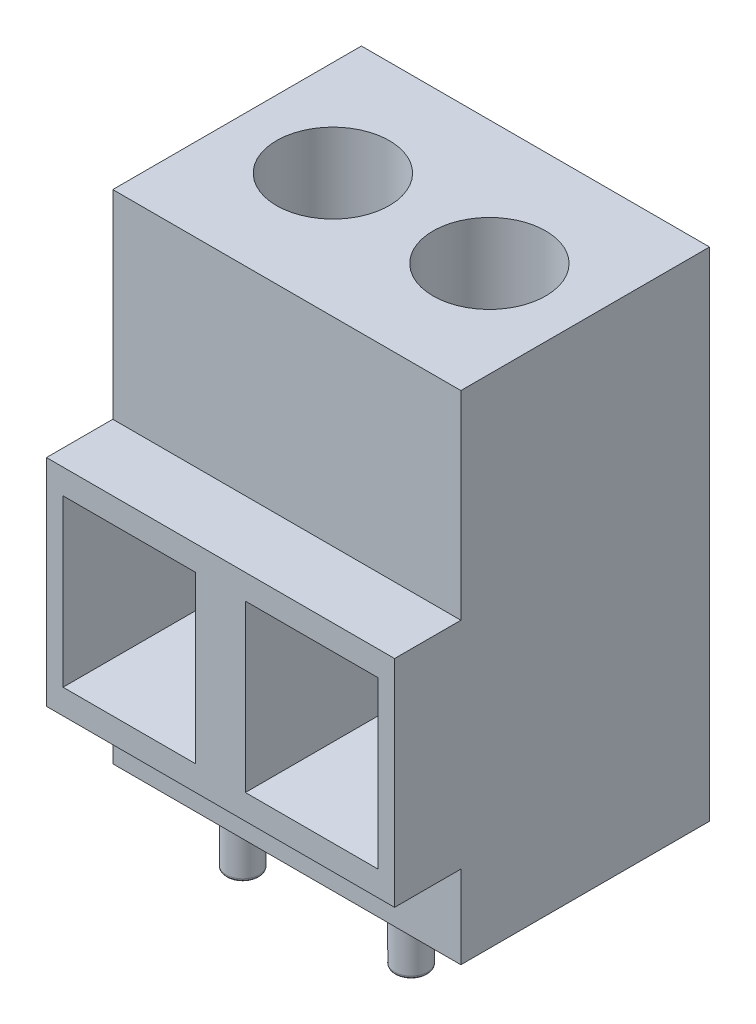
ISO-10303-21;
HEADER;
FILE_DESCRIPTION(('STEP AP214'),'2;1');
FILE_NAME('part.step','',(''),(''),'','','');
FILE_SCHEMA(('AUTOMOTIVE_DESIGN { 1 0 10303 214 1 1 1 1 }'));
ENDSEC;
DATA;
#1=APPLICATION_CONTEXT('core data for automotive mechanical design processes');
#2=APPLICATION_PROTOCOL_DEFINITION('international standard','automotive_design',2000,#1);
#3=PRODUCT_CONTEXT('',#1,'mechanical');
#4=PRODUCT('Part','Part','',(#3));
#5=PRODUCT_RELATED_PRODUCT_CATEGORY('part','',(#4));
#6=PRODUCT_DEFINITION_FORMATION('','',#4);
#7=PRODUCT_DEFINITION_CONTEXT('part definition',#1,'design');
#8=PRODUCT_DEFINITION('design','',#6,#7);
#9=PRODUCT_DEFINITION_SHAPE('','',#8);
#10=(LENGTH_UNIT() NAMED_UNIT(*) SI_UNIT(.MILLI.,.METRE.));
#11=(NAMED_UNIT(*) PLANE_ANGLE_UNIT() SI_UNIT($,.RADIAN.));
#12=(NAMED_UNIT(*) SI_UNIT($,.STERADIAN.) SOLID_ANGLE_UNIT());
#13=UNCERTAINTY_MEASURE_WITH_UNIT(LENGTH_MEASURE(1.E-05),#10,'distance_accuracy_value','');
#14=(GEOMETRIC_REPRESENTATION_CONTEXT(3) GLOBAL_UNCERTAINTY_ASSIGNED_CONTEXT((#13)) GLOBAL_UNIT_ASSIGNED_CONTEXT((#10,
#11,#12)) REPRESENTATION_CONTEXT('',''));
#15=CARTESIAN_POINT('',(0.,0.,0.));
#16=DIRECTION('',(0.,0.,1.));
#17=DIRECTION('',(1.,0.,0.));
#18=AXIS2_PLACEMENT_3D('',#15,#16,#17);
#19=CARTESIAN_POINT('',(4.72,7.,0.));
#20=DIRECTION('',(0.,1.,0.));
#21=DIRECTION('',(0.,0.,1.));
#22=AXIS2_PLACEMENT_3D('',#19,#20,#21);
#23=PLANE('',#22);
#24=CARTESIAN_POINT('',(4.72,7.,0.));
#25=DIRECTION('',(0.,1.,0.));
#26=DIRECTION('',(0.,0.,1.));
#27=AXIS2_PLACEMENT_3D('',#24,#25,#26);
#28=CIRCLE('',#27,3.4);
#29=CARTESIAN_POINT('',(8.08303434416005,7.,-0.5));
#30=VERTEX_POINT('',#29);
#31=CARTESIAN_POINT('',(1.35696565583995,7.,-0.5));
#32=VERTEX_POINT('',#31);
#33=EDGE_CURVE('E220',#30,#32,#28,.T.);
#34=ORIENTED_EDGE('',*,*,#33,.T.);
#35=DIRECTION('',(1.,0.,0.));
#36=VECTOR('',#35,1.);
#37=CARTESIAN_POINT('',(1.35696565583995,7.,-0.5));
#38=LINE('',#37,#36);
#39=EDGE_CURVE('E231',#32,#30,#38,.T.);
#40=ORIENTED_EDGE('',*,*,#39,.T.);
#41=EDGE_LOOP('',(#34,#40));
#42=FACE_BOUND('',#41,.T.);
#43=ADVANCED_FACE('F37',(#42),#23,.T.);
#44=CARTESIAN_POINT('',(-4.72,7.,0.));
#45=DIRECTION('',(0.,1.,0.));
#46=DIRECTION('',(0.,0.,1.));
#47=AXIS2_PLACEMENT_3D('',#44,#45,#46);
#48=PLANE('',#47);
#49=CARTESIAN_POINT('',(-4.72,7.,0.));
#50=DIRECTION('',(0.,1.,0.));
#51=DIRECTION('',(0.,0.,1.));
#52=AXIS2_PLACEMENT_3D('',#49,#50,#51);
#53=CIRCLE('',#52,3.4);
#54=CARTESIAN_POINT('',(-1.35696565583995,7.,-0.5));
#55=VERTEX_POINT('',#54);
#56=CARTESIAN_POINT('',(-8.08303434416005,7.,-0.5));
#57=VERTEX_POINT('',#56);
#58=EDGE_CURVE('E325',#55,#57,#53,.T.);
#59=ORIENTED_EDGE('',*,*,#58,.T.);
#60=DIRECTION('',(1.,0.,0.));
#61=VECTOR('',#60,1.);
#62=CARTESIAN_POINT('',(0.,7.,-0.5));
#63=LINE('',#62,#61);
#64=EDGE_CURVE('E221',#57,#55,#63,.T.);
#65=ORIENTED_EDGE('',*,*,#64,.T.);
#66=EDGE_LOOP('',(#59,#65));
#67=FACE_BOUND('',#66,.T.);
#68=ADVANCED_FACE('F436',(#67),#48,.T.);
#69=CARTESIAN_POINT('',(10.5,-15.,0.));
#70=DIRECTION('',(0.,1.,0.));
#71=DIRECTION('',(0.,0.,1.));
#72=AXIS2_PLACEMENT_3D('',#69,#70,#71);
#73=PLANE('',#72);
#74=CARTESIAN_POINT('',(-5.08,-15.,-5.08));
#75=DIRECTION('',(0.,1.,0.));
#76=DIRECTION('',(0.,0.,1.));
#77=AXIS2_PLACEMENT_3D('',#74,#75,#76);
#78=CIRCLE('',#77,1.);
#79=CARTESIAN_POINT('',(-5.08,-15.,-4.08));
#80=VERTEX_POINT('',#79);
#81=EDGE_CURVE('E401',#80,#80,#78,.F.);
#82=ORIENTED_EDGE('',*,*,#81,.F.);
#83=EDGE_LOOP('',(#82));
#84=FACE_BOUND('',#83,.T.);
#85=CARTESIAN_POINT('',(5.08,-15.,-5.08));
#86=DIRECTION('',(0.,1.,0.));
#87=DIRECTION('',(0.,0.,1.));
#88=AXIS2_PLACEMENT_3D('',#85,#86,#87);
#89=CIRCLE('',#88,1.);
#90=CARTESIAN_POINT('',(5.08,-15.,-4.08));
#91=VERTEX_POINT('',#90);
#92=EDGE_CURVE('E398',#91,#91,#89,.F.);
#93=ORIENTED_EDGE('',*,*,#92,.F.);
#94=EDGE_LOOP('',(#93));
#95=FACE_BOUND('',#94,.T.);
#96=CARTESIAN_POINT('',(5.08,-15.,5.08));
#97=DIRECTION('',(0.,1.,0.));
#98=DIRECTION('',(0.,0.,1.));
#99=AXIS2_PLACEMENT_3D('',#96,#97,#98);
#100=CIRCLE('',#99,1.);
#101=CARTESIAN_POINT('',(5.08,-15.,6.08));
#102=VERTEX_POINT('',#101);
#103=EDGE_CURVE('E395',#102,#102,#100,.F.);
#104=ORIENTED_EDGE('',*,*,#103,.F.);
#105=EDGE_LOOP('',(#104));
#106=FACE_BOUND('',#105,.T.);
#107=CARTESIAN_POINT('',(-5.08,-15.,5.08));
#108=DIRECTION('',(0.,1.,0.));
#109=DIRECTION('',(0.,0.,1.));
#110=AXIS2_PLACEMENT_3D('',#107,#108,#109);
#111=CIRCLE('',#110,1.);
#112=CARTESIAN_POINT('',(-5.08,-15.,6.08));
#113=VERTEX_POINT('',#112);
#114=EDGE_CURVE('E392',#113,#113,#111,.F.);
#115=ORIENTED_EDGE('',*,*,#114,.F.);
#116=EDGE_LOOP('',(#115));
#117=FACE_BOUND('',#116,.T.);
#118=DIRECTION('',(0.,0.,-1.));
#119=VECTOR('',#118,1.);
#120=CARTESIAN_POINT('',(-10.5,-15.,0.));
#121=LINE('',#120,#119);
#122=CARTESIAN_POINT('',(-10.5,-15.,7.5));
#123=VERTEX_POINT('',#122);
#124=CARTESIAN_POINT('',(-10.5,-15.,-7.5));
#125=VERTEX_POINT('',#124);
#126=EDGE_CURVE('E354',#123,#125,#121,.T.);
#127=ORIENTED_EDGE('',*,*,#126,.T.);
#128=DIRECTION('',(-1.,0.,0.));
#129=VECTOR('',#128,1.);
#130=CARTESIAN_POINT('',(10.5,-15.,-7.5));
#131=LINE('',#130,#129);
#132=CARTESIAN_POINT('',(10.5,-15.,-7.5));
#133=VERTEX_POINT('',#132);
#134=EDGE_CURVE('E389',#133,#125,#131,.T.);
#135=ORIENTED_EDGE('',*,*,#134,.F.);
#136=DIRECTION('',(0.,0.,-1.));
#137=VECTOR('',#136,1.);
#138=CARTESIAN_POINT('',(10.5,-15.,0.));
#139=LINE('',#138,#137);
#140=CARTESIAN_POINT('',(10.5,-15.,7.5));
#141=VERTEX_POINT('',#140);
#142=EDGE_CURVE('E334',#141,#133,#139,.T.);
#143=ORIENTED_EDGE('',*,*,#142,.F.);
#144=DIRECTION('',(-1.,0.,0.));
#145=VECTOR('',#144,1.);
#146=CARTESIAN_POINT('',(10.5,-15.,7.5));
#147=LINE('',#146,#145);
#148=EDGE_CURVE('E374',#141,#123,#147,.T.);
#149=ORIENTED_EDGE('',*,*,#148,.T.);
#150=EDGE_LOOP('',(#127,#135,#143,#149));
#151=FACE_BOUND('',#150,.T.);
#152=ADVANCED_FACE('F443',(#84,#95,#106,#117,#151),#73,.F.);
#153=CARTESIAN_POINT('',(10.5,0.,-7.5));
#154=DIRECTION('',(0.,0.,1.));
#155=DIRECTION('',(1.,0.,0.));
#156=AXIS2_PLACEMENT_3D('',#153,#154,#155);
#157=PLANE('',#156);
#158=DIRECTION('',(0.,1.,0.));
#159=VECTOR('',#158,1.);
#160=CARTESIAN_POINT('',(-10.5,0.,-7.5));
#161=LINE('',#160,#159);
#162=CARTESIAN_POINT('',(-10.5,15.,-7.5));
#163=VERTEX_POINT('',#162);
#164=EDGE_CURVE('E357',#125,#163,#161,.T.);
#165=ORIENTED_EDGE('',*,*,#164,.T.);
#166=DIRECTION('',(-1.,0.,0.));
#167=VECTOR('',#166,1.);
#168=CARTESIAN_POINT('',(10.5,15.,-7.5));
#169=LINE('',#168,#167);
#170=CARTESIAN_POINT('',(10.5,15.,-7.5));
#171=VERTEX_POINT('',#170);
#172=EDGE_CURVE('E387',#171,#163,#169,.T.);
#173=ORIENTED_EDGE('',*,*,#172,.F.);
#174=DIRECTION('',(0.,1.,0.));
#175=VECTOR('',#174,1.);
#176=CARTESIAN_POINT('',(10.5,0.,-7.5));
#177=LINE('',#176,#175);
#178=EDGE_CURVE('E337',#133,#171,#177,.T.);
#179=ORIENTED_EDGE('',*,*,#178,.F.);
#180=ORIENTED_EDGE('',*,*,#134,.T.);
#181=EDGE_LOOP('',(#165,#173,#179,#180));
#182=FACE_BOUND('',#181,.T.);
#183=ADVANCED_FACE('F541',(#182),#157,.F.);
#184=CARTESIAN_POINT('',(10.5,15.,0.));
#185=DIRECTION('',(0.,1.,0.));
#186=DIRECTION('',(0.,0.,1.));
#187=AXIS2_PLACEMENT_3D('',#184,#185,#186);
#188=PLANE('',#187);
#189=CARTESIAN_POINT('',(-4.72,15.,0.));
#190=DIRECTION('',(0.,1.,0.));
#191=DIRECTION('',(0.,0.,1.));
#192=AXIS2_PLACEMENT_3D('',#189,#190,#191);
#193=CIRCLE('',#192,3.4);
#194=CARTESIAN_POINT('',(-4.72,15.,3.4));
#195=VERTEX_POINT('',#194);
#196=EDGE_CURVE('E326',#195,#195,#193,.T.);
#197=ORIENTED_EDGE('',*,*,#196,.F.);
#198=EDGE_LOOP('',(#197));
#199=FACE_BOUND('',#198,.T.);
#200=CARTESIAN_POINT('',(4.72,15.,0.));
#201=DIRECTION('',(0.,1.,0.));
#202=DIRECTION('',(0.,0.,1.));
#203=AXIS2_PLACEMENT_3D('',#200,#201,#202);
#204=CIRCLE('',#203,3.4);
#205=CARTESIAN_POINT('',(4.72,15.,3.4));
#206=VERTEX_POINT('',#205);
#207=EDGE_CURVE('E273',#206,#206,#204,.T.);
#208=ORIENTED_EDGE('',*,*,#207,.F.);
#209=EDGE_LOOP('',(#208));
#210=FACE_BOUND('',#209,.T.);
#211=DIRECTION('',(0.,0.,-1.));
#212=VECTOR('',#211,1.);
#213=CARTESIAN_POINT('',(-10.5,15.,0.));
#214=LINE('',#213,#212);
#215=CARTESIAN_POINT('',(-10.5,15.,7.5));
#216=VERTEX_POINT('',#215);
#217=EDGE_CURVE('E360',#216,#163,#214,.T.);
#218=ORIENTED_EDGE('',*,*,#217,.F.);
#219=DIRECTION('',(-1.,0.,0.));
#220=VECTOR('',#219,1.);
#221=CARTESIAN_POINT('',(10.5,15.,7.5));
#222=LINE('',#221,#220);
#223=CARTESIAN_POINT('',(10.5,15.,7.5));
#224=VERTEX_POINT('',#223);
#225=EDGE_CURVE('E385',#224,#216,#222,.T.);
#226=ORIENTED_EDGE('',*,*,#225,.F.);
#227=DIRECTION('',(0.,0.,-1.));
#228=VECTOR('',#227,1.);
#229=CARTESIAN_POINT('',(10.5,15.,0.));
#230=LINE('',#229,#228);
#231=EDGE_CURVE('E340',#224,#171,#230,.T.);
#232=ORIENTED_EDGE('',*,*,#231,.T.);
#233=ORIENTED_EDGE('',*,*,#172,.T.);
#234=EDGE_LOOP('',(#218,#226,#232,#233));
#235=FACE_BOUND('',#234,.T.);
#236=ADVANCED_FACE('F537',(#199,#210,#235),#188,.T.);
#237=CARTESIAN_POINT('',(10.5,0.,7.5));
#238=DIRECTION('',(0.,0.,1.));
#239=DIRECTION('',(1.,0.,0.));
#240=AXIS2_PLACEMENT_3D('',#237,#238,#239);
#241=PLANE('',#240);
#242=DIRECTION('',(0.,1.,0.));
#243=VECTOR('',#242,1.);
#244=CARTESIAN_POINT('',(-10.5,0.,7.5));
#245=LINE('',#244,#243);
#246=CARTESIAN_POINT('',(-10.5,3.,7.5));
#247=VERTEX_POINT('',#246);
#248=EDGE_CURVE('E363',#247,#216,#245,.T.);
#249=ORIENTED_EDGE('',*,*,#248,.F.);
#250=DIRECTION('',(-1.,0.,0.));
#251=VECTOR('',#250,1.);
#252=CARTESIAN_POINT('',(10.5,3.,7.5));
#253=LINE('',#252,#251);
#254=CARTESIAN_POINT('',(10.5,3.,7.5));
#255=VERTEX_POINT('',#254);
#256=EDGE_CURVE('E383',#255,#247,#253,.T.);
#257=ORIENTED_EDGE('',*,*,#256,.F.);
#258=DIRECTION('',(0.,1.,0.));
#259=VECTOR('',#258,1.);
#260=CARTESIAN_POINT('',(10.5,0.,7.5));
#261=LINE('',#260,#259);
#262=EDGE_CURVE('E343',#255,#224,#261,.T.);
#263=ORIENTED_EDGE('',*,*,#262,.T.);
#264=ORIENTED_EDGE('',*,*,#225,.T.);
#265=EDGE_LOOP('',(#249,#257,#263,#264));
#266=FACE_BOUND('',#265,.T.);
#267=ADVANCED_FACE('F540',(#266),#241,.T.);
#268=CARTESIAN_POINT('',(10.5,3.,0.));
#269=DIRECTION('',(0.,-1.,0.));
#270=DIRECTION('',(0.,0.,-1.));
#271=AXIS2_PLACEMENT_3D('',#268,#269,#270);
#272=PLANE('',#271);
#273=DIRECTION('',(0.,0.,1.));
#274=VECTOR('',#273,1.);
#275=CARTESIAN_POINT('',(-10.5,3.,0.));
#276=LINE('',#275,#274);
#277=CARTESIAN_POINT('',(-10.5,3.,11.5));
#278=VERTEX_POINT('',#277);
#279=EDGE_CURVE('E366',#247,#278,#276,.T.);
#280=ORIENTED_EDGE('',*,*,#279,.T.);
#281=DIRECTION('',(-1.,0.,0.));
#282=VECTOR('',#281,1.);
#283=CARTESIAN_POINT('',(10.5,3.,11.5));
#284=LINE('',#283,#282);
#285=CARTESIAN_POINT('',(10.5,3.,11.5));
#286=VERTEX_POINT('',#285);
#287=EDGE_CURVE('E380',#286,#278,#284,.T.);
#288=ORIENTED_EDGE('',*,*,#287,.F.);
#289=DIRECTION('',(0.,0.,1.));
#290=VECTOR('',#289,1.);
#291=CARTESIAN_POINT('',(10.5,3.,0.));
#292=LINE('',#291,#290);
#293=EDGE_CURVE('E346',#255,#286,#292,.T.);
#294=ORIENTED_EDGE('',*,*,#293,.F.);
#295=ORIENTED_EDGE('',*,*,#256,.T.);
#296=EDGE_LOOP('',(#280,#288,#294,#295));
#297=FACE_BOUND('',#296,.T.);
#298=ADVANCED_FACE('F578',(#297),#272,.F.);
#299=CARTESIAN_POINT('',(10.5,0.,11.5));
#300=DIRECTION('',(0.,0.,-1.));
#301=DIRECTION('',(0.,1.,0.));
#302=AXIS2_PLACEMENT_3D('',#299,#300,#301);
#303=PLANE('',#302);
#304=DIRECTION('',(-1.,0.,0.));
#305=VECTOR('',#304,1.);
#306=CARTESIAN_POINT('',(-9.5,1.5,11.5));
#307=LINE('',#306,#305);
#308=CARTESIAN_POINT('',(-1.5,1.5,11.5));
#309=VERTEX_POINT('',#308);
#310=CARTESIAN_POINT('',(-9.5,1.5,11.5));
#311=VERTEX_POINT('',#310);
#312=EDGE_CURVE('E260',#309,#311,#307,.T.);
#313=ORIENTED_EDGE('',*,*,#312,.F.);
#314=DIRECTION('',(0.,1.,0.));
#315=VECTOR('',#314,1.);
#316=CARTESIAN_POINT('',(-1.5,-8.5,11.5));
#317=LINE('',#316,#315);
#318=CARTESIAN_POINT('',(-1.5,-8.5,11.5));
#319=VERTEX_POINT('',#318);
#320=EDGE_CURVE('E258',#319,#309,#317,.T.);
#321=ORIENTED_EDGE('',*,*,#320,.F.);
#322=DIRECTION('',(1.,0.,0.));
#323=VECTOR('',#322,1.);
#324=CARTESIAN_POINT('',(-9.5,-8.5,11.5));
#325=LINE('',#324,#323);
#326=CARTESIAN_POINT('',(-9.5,-8.5,11.5));
#327=VERTEX_POINT('',#326);
#328=EDGE_CURVE('E267',#327,#319,#325,.T.);
#329=ORIENTED_EDGE('',*,*,#328,.F.);
#330=DIRECTION('',(0.,-1.,0.));
#331=VECTOR('',#330,1.);
#332=CARTESIAN_POINT('',(-9.5,-8.5,11.5));
#333=LINE('',#332,#331);
#334=EDGE_CURVE('E264',#311,#327,#333,.T.);
#335=ORIENTED_EDGE('',*,*,#334,.F.);
#336=EDGE_LOOP('',(#313,#321,#329,#335));
#337=FACE_BOUND('',#336,.T.);
#338=DIRECTION('',(-1.,0.,0.));
#339=VECTOR('',#338,1.);
#340=CARTESIAN_POINT('',(1.5,1.5,11.5));
#341=LINE('',#340,#339);
#342=CARTESIAN_POINT('',(9.5,1.5,11.5));
#343=VERTEX_POINT('',#342);
#344=CARTESIAN_POINT('',(1.5,1.5,11.5));
#345=VERTEX_POINT('',#344);
#346=EDGE_CURVE('E293',#343,#345,#341,.T.);
#347=ORIENTED_EDGE('',*,*,#346,.F.);
#348=DIRECTION('',(0.,1.,0.));
#349=VECTOR('',#348,1.);
#350=CARTESIAN_POINT('',(9.5,-8.5,11.5));
#351=LINE('',#350,#349);
#352=CARTESIAN_POINT('',(9.5,-8.5,11.5));
#353=VERTEX_POINT('',#352);
#354=EDGE_CURVE('E252',#353,#343,#351,.T.);
#355=ORIENTED_EDGE('',*,*,#354,.F.);
#356=DIRECTION('',(1.,0.,0.));
#357=VECTOR('',#356,1.);
#358=CARTESIAN_POINT('',(1.5,-8.5,11.5));
#359=LINE('',#358,#357);
#360=CARTESIAN_POINT('',(1.5,-8.5,11.5));
#361=VERTEX_POINT('',#360);
#362=EDGE_CURVE('E299',#361,#353,#359,.T.);
#363=ORIENTED_EDGE('',*,*,#362,.F.);
#364=DIRECTION('',(0.,-1.,0.));
#365=VECTOR('',#364,1.);
#366=CARTESIAN_POINT('',(1.5,-8.5,11.5));
#367=LINE('',#366,#365);
#368=EDGE_CURVE('E296',#345,#361,#367,.T.);
#369=ORIENTED_EDGE('',*,*,#368,.F.);
#370=EDGE_LOOP('',(#347,#355,#363,#369));
#371=FACE_BOUND('',#370,.T.);
#372=DIRECTION('',(0.,-1.,0.));
#373=VECTOR('',#372,1.);
#374=CARTESIAN_POINT('',(-10.5,0.,11.5));
#375=LINE('',#374,#373);
#376=CARTESIAN_POINT('',(-10.5,-10.,11.5));
#377=VERTEX_POINT('',#376);
#378=EDGE_CURVE('E368',#278,#377,#375,.T.);
#379=ORIENTED_EDGE('',*,*,#378,.T.);
#380=DIRECTION('',(-1.,0.,0.));
#381=VECTOR('',#380,1.);
#382=CARTESIAN_POINT('',(10.5,-10.,11.5));
#383=LINE('',#382,#381);
#384=CARTESIAN_POINT('',(10.5,-10.,11.5));
#385=VERTEX_POINT('',#384);
#386=EDGE_CURVE('E378',#385,#377,#383,.T.);
#387=ORIENTED_EDGE('',*,*,#386,.F.);
#388=DIRECTION('',(0.,-1.,0.));
#389=VECTOR('',#388,1.);
#390=CARTESIAN_POINT('',(10.5,0.,11.5));
#391=LINE('',#390,#389);
#392=EDGE_CURVE('E349',#286,#385,#391,.T.);
#393=ORIENTED_EDGE('',*,*,#392,.F.);
#394=ORIENTED_EDGE('',*,*,#287,.T.);
#395=EDGE_LOOP('',(#379,#387,#393,#394));
#396=FACE_BOUND('',#395,.T.);
#397=ADVANCED_FACE('F575',(#337,#371,#396),#303,.F.);
#398=CARTESIAN_POINT('',(10.5,-10.,0.));
#399=DIRECTION('',(0.,-1.,0.));
#400=DIRECTION('',(0.,0.,-1.));
#401=AXIS2_PLACEMENT_3D('',#398,#399,#400);
#402=PLANE('',#401);
#403=DIRECTION('',(0.,0.,1.));
#404=VECTOR('',#403,1.);
#405=CARTESIAN_POINT('',(-10.5,-10.,0.));
#406=LINE('',#405,#404);
#407=CARTESIAN_POINT('',(-10.5,-10.,7.5));
#408=VERTEX_POINT('',#407);
#409=EDGE_CURVE('E371',#408,#377,#406,.T.);
#410=ORIENTED_EDGE('',*,*,#409,.F.);
#411=DIRECTION('',(-1.,0.,0.));
#412=VECTOR('',#411,1.);
#413=CARTESIAN_POINT('',(10.5,-10.,7.5));
#414=LINE('',#413,#412);
#415=CARTESIAN_POINT('',(10.5,-10.,7.5));
#416=VERTEX_POINT('',#415);
#417=EDGE_CURVE('E376',#416,#408,#414,.T.);
#418=ORIENTED_EDGE('',*,*,#417,.F.);
#419=DIRECTION('',(0.,0.,1.));
#420=VECTOR('',#419,1.);
#421=CARTESIAN_POINT('',(10.5,-10.,0.));
#422=LINE('',#421,#420);
#423=EDGE_CURVE('E351',#416,#385,#422,.T.);
#424=ORIENTED_EDGE('',*,*,#423,.T.);
#425=ORIENTED_EDGE('',*,*,#386,.T.);
#426=EDGE_LOOP('',(#410,#418,#424,#425));
#427=FACE_BOUND('',#426,.T.);
#428=ADVANCED_FACE('F572',(#427),#402,.T.);
#429=EDGE_CURVE('E338',#123,#408,#245,.T.);
#430=ORIENTED_EDGE('',*,*,#429,.F.);
#431=ORIENTED_EDGE('',*,*,#148,.F.);
#432=EDGE_CURVE('E347',#141,#416,#261,.T.);
#433=ORIENTED_EDGE('',*,*,#432,.T.);
#434=ORIENTED_EDGE('',*,*,#417,.T.);
#435=EDGE_LOOP('',(#430,#431,#433,#434));
#436=FACE_BOUND('',#435,.T.);
#437=ADVANCED_FACE('F567',(#436),#241,.T.);
#438=CARTESIAN_POINT('',(10.5,0.,0.));
#439=DIRECTION('',(1.,0.,0.));
#440=DIRECTION('',(0.,0.,-1.));
#441=AXIS2_PLACEMENT_3D('',#438,#439,#440);
#442=PLANE('',#441);
#443=ORIENTED_EDGE('',*,*,#142,.T.);
#444=ORIENTED_EDGE('',*,*,#178,.T.);
#445=ORIENTED_EDGE('',*,*,#231,.F.);
#446=ORIENTED_EDGE('',*,*,#262,.F.);
#447=ORIENTED_EDGE('',*,*,#293,.T.);
#448=ORIENTED_EDGE('',*,*,#392,.T.);
#449=ORIENTED_EDGE('',*,*,#423,.F.);
#450=ORIENTED_EDGE('',*,*,#432,.F.);
#451=EDGE_LOOP('',(#443,#444,#445,#446,#447,#448,#449,#450));
#452=FACE_BOUND('',#451,.T.);
#453=ADVANCED_FACE('F557',(#452),#442,.T.);
#454=CARTESIAN_POINT('',(-10.5,0.,0.));
#455=DIRECTION('',(1.,0.,0.));
#456=DIRECTION('',(0.,0.,-1.));
#457=AXIS2_PLACEMENT_3D('',#454,#455,#456);
#458=PLANE('',#457);
#459=ORIENTED_EDGE('',*,*,#126,.F.);
#460=ORIENTED_EDGE('',*,*,#429,.T.);
#461=ORIENTED_EDGE('',*,*,#409,.T.);
#462=ORIENTED_EDGE('',*,*,#378,.F.);
#463=ORIENTED_EDGE('',*,*,#279,.F.);
#464=ORIENTED_EDGE('',*,*,#248,.T.);
#465=ORIENTED_EDGE('',*,*,#217,.T.);
#466=ORIENTED_EDGE('',*,*,#164,.F.);
#467=EDGE_LOOP('',(#459,#460,#461,#462,#463,#464,#465,#466));
#468=FACE_BOUND('',#467,.T.);
#469=ADVANCED_FACE('F457',(#468),#458,.F.);
#470=CARTESIAN_POINT('',(4.72,7.,0.));
#471=DIRECTION('',(0.,1.,0.));
#472=DIRECTION('',(0.,0.,1.));
#473=AXIS2_PLACEMENT_3D('',#470,#471,#472);
#474=CYLINDRICAL_SURFACE('',#473,3.4);
#475=ORIENTED_EDGE('',*,*,#33,.F.);
#476=DIRECTION('',(0.,1.,0.));
#477=VECTOR('',#476,1.);
#478=CARTESIAN_POINT('',(8.08303434416005,6.,-0.5));
#479=LINE('',#478,#477);
#480=CARTESIAN_POINT('',(8.08303434416005,6.,-0.5));
#481=VERTEX_POINT('',#480);
#482=EDGE_CURVE('E203',#481,#30,#479,.T.);
#483=ORIENTED_EDGE('',*,*,#482,.F.);
#484=CARTESIAN_POINT('',(4.72,6.,0.));
#485=DIRECTION('',(0.,1.,0.));
#486=DIRECTION('',(0.,0.,1.));
#487=AXIS2_PLACEMENT_3D('',#484,#485,#486);
#488=CIRCLE('',#487,3.4);
#489=CARTESIAN_POINT('',(8.08303434416005,6.,0.5));
#490=VERTEX_POINT('',#489);
#491=EDGE_CURVE('E210',#490,#481,#488,.T.);
#492=ORIENTED_EDGE('',*,*,#491,.F.);
#493=DIRECTION('',(0.,1.,0.));
#494=VECTOR('',#493,1.);
#495=CARTESIAN_POINT('',(8.08303434416005,6.,0.5));
#496=LINE('',#495,#494);
#497=CARTESIAN_POINT('',(8.08303434416005,7.,0.5));
#498=VERTEX_POINT('',#497);
#499=EDGE_CURVE('E222',#490,#498,#496,.T.);
#500=ORIENTED_EDGE('',*,*,#499,.T.);
#501=CARTESIAN_POINT('',(1.35696565583995,7.,0.5));
#502=VERTEX_POINT('',#501);
#503=EDGE_CURVE('E329',#502,#498,#28,.T.);
#504=ORIENTED_EDGE('',*,*,#503,.F.);
#505=DIRECTION('',(0.,1.,0.));
#506=VECTOR('',#505,1.);
#507=CARTESIAN_POINT('',(1.35696565583995,6.,0.499999999999999));
#508=LINE('',#507,#506);
#509=CARTESIAN_POINT('',(1.35696565583995,6.,0.499999999999999));
#510=VERTEX_POINT('',#509);
#511=EDGE_CURVE('E52',#510,#502,#508,.T.);
#512=ORIENTED_EDGE('',*,*,#511,.F.);
#513=CARTESIAN_POINT('',(4.72,6.,0.));
#514=DIRECTION('',(0.,1.,0.));
#515=DIRECTION('',(0.,0.,1.));
#516=AXIS2_PLACEMENT_3D('',#513,#514,#515);
#517=CIRCLE('',#516,3.4);
#518=CARTESIAN_POINT('',(1.35696565583995,6.,-0.5));
#519=VERTEX_POINT('',#518);
#520=EDGE_CURVE('E227',#519,#510,#517,.T.);
#521=ORIENTED_EDGE('',*,*,#520,.F.);
#522=DIRECTION('',(0.,1.,0.));
#523=VECTOR('',#522,1.);
#524=CARTESIAN_POINT('',(1.35696565583995,6.,-0.5));
#525=LINE('',#524,#523);
#526=EDGE_CURVE('E205',#519,#32,#525,.T.);
#527=ORIENTED_EDGE('',*,*,#526,.T.);
#528=EDGE_LOOP('',(#475,#483,#492,#500,#504,#512,#521,#527));
#529=FACE_BOUND('',#528,.T.);
#530=ORIENTED_EDGE('',*,*,#207,.T.);
#531=EDGE_LOOP('',(#530));
#532=FACE_BOUND('',#531,.T.);
#533=ADVANCED_FACE('F216',(#529,#532),#474,.F.);
#534=DIRECTION('',(1.,0.,0.));
#535=VECTOR('',#534,1.);
#536=CARTESIAN_POINT('',(1.35696565583995,7.,0.5));
#537=LINE('',#536,#535);
#538=EDGE_CURVE('E211',#502,#498,#537,.T.);
#539=ORIENTED_EDGE('',*,*,#538,.F.);
#540=ORIENTED_EDGE('',*,*,#503,.T.);
#541=EDGE_LOOP('',(#539,#540));
#542=FACE_BOUND('',#541,.T.);
#543=ADVANCED_FACE('F439',(#542),#23,.T.);
#544=CARTESIAN_POINT('',(-4.72,7.,0.));
#545=DIRECTION('',(0.,1.,0.));
#546=DIRECTION('',(0.,0.,1.));
#547=AXIS2_PLACEMENT_3D('',#544,#545,#546);
#548=CYLINDRICAL_SURFACE('',#547,3.4);
#549=ORIENTED_EDGE('',*,*,#58,.F.);
#550=DIRECTION('',(0.,1.,0.));
#551=VECTOR('',#550,1.);
#552=CARTESIAN_POINT('',(-1.35696565583995,6.,-0.5));
#553=LINE('',#552,#551);
#554=CARTESIAN_POINT('',(-1.35696565583995,6.,-0.5));
#555=VERTEX_POINT('',#554);
#556=EDGE_CURVE('E250',#555,#55,#553,.T.);
#557=ORIENTED_EDGE('',*,*,#556,.F.);
#558=CARTESIAN_POINT('',(-4.72,6.,0.));
#559=DIRECTION('',(0.,1.,0.));
#560=DIRECTION('',(0.,0.,1.));
#561=AXIS2_PLACEMENT_3D('',#558,#559,#560);
#562=CIRCLE('',#561,3.4);
#563=CARTESIAN_POINT('',(-1.35696565583995,6.,0.5));
#564=VERTEX_POINT('',#563);
#565=EDGE_CURVE('E244',#564,#555,#562,.T.);
#566=ORIENTED_EDGE('',*,*,#565,.F.);
#567=DIRECTION('',(0.,1.,0.));
#568=VECTOR('',#567,1.);
#569=CARTESIAN_POINT('',(-1.35696565583995,6.,0.5));
#570=LINE('',#569,#568);
#571=CARTESIAN_POINT('',(-1.35696565583995,7.,0.5));
#572=VERTEX_POINT('',#571);
#573=EDGE_CURVE('E253',#564,#572,#570,.T.);
#574=ORIENTED_EDGE('',*,*,#573,.T.);
#575=CARTESIAN_POINT('',(-8.08303434416005,7.,0.5));
#576=VERTEX_POINT('',#575);
#577=EDGE_CURVE('E322',#576,#572,#53,.T.);
#578=ORIENTED_EDGE('',*,*,#577,.F.);
#579=DIRECTION('',(0.,1.,0.));
#580=VECTOR('',#579,1.);
#581=CARTESIAN_POINT('',(-8.08303434416005,6.,0.5));
#582=LINE('',#581,#580);
#583=CARTESIAN_POINT('',(-8.08303434416005,6.,0.5));
#584=VERTEX_POINT('',#583);
#585=EDGE_CURVE('E60',#584,#576,#582,.T.);
#586=ORIENTED_EDGE('',*,*,#585,.F.);
#587=CARTESIAN_POINT('',(-8.08303434416005,6.,-0.5));
#588=VERTEX_POINT('',#587);
#589=EDGE_CURVE('E239',#588,#584,#562,.T.);
#590=ORIENTED_EDGE('',*,*,#589,.F.);
#591=DIRECTION('',(0.,1.,0.));
#592=VECTOR('',#591,1.);
#593=CARTESIAN_POINT('',(-8.08303434416005,6.,-0.5));
#594=LINE('',#593,#592);
#595=EDGE_CURVE('E256',#588,#57,#594,.T.);
#596=ORIENTED_EDGE('',*,*,#595,.T.);
#597=EDGE_LOOP('',(#549,#557,#566,#574,#578,#586,#590,#596));
#598=FACE_BOUND('',#597,.T.);
#599=ORIENTED_EDGE('',*,*,#196,.T.);
#600=EDGE_LOOP('',(#599));
#601=FACE_BOUND('',#600,.T.);
#602=ADVANCED_FACE('F450',(#598,#601),#548,.F.);
#603=DIRECTION('',(1.,0.,0.));
#604=VECTOR('',#603,1.);
#605=CARTESIAN_POINT('',(0.,7.,0.5));
#606=LINE('',#605,#604);
#607=EDGE_CURVE('E240',#576,#572,#606,.T.);
#608=ORIENTED_EDGE('',*,*,#607,.F.);
#609=ORIENTED_EDGE('',*,*,#577,.T.);
#610=EDGE_LOOP('',(#608,#609));
#611=FACE_BOUND('',#610,.T.);
#612=ADVANCED_FACE('F446',(#611),#48,.T.);
#613=CARTESIAN_POINT('',(9.5,-8.5,11.5));
#614=DIRECTION('',(0.994521895368273,0.,-0.104528463267654));
#615=DIRECTION('',(-0.104528463267654,0.,-0.994521895368273));
#616=AXIS2_PLACEMENT_3D('',#613,#614,#615);
#617=PLANE('',#616);
#618=ORIENTED_EDGE('',*,*,#354,.T.);
#619=DIRECTION('',(0.103962051184498,0.103962051184498,0.989132844377854));
#620=VECTOR('',#619,1.);
#621=CARTESIAN_POINT('',(9.39191891913512,1.39191891913512,10.4716772060452));
#622=LINE('',#621,#620);
#623=CARTESIAN_POINT('',(7.81833223574917,-0.181667764250827,-4.5));
#624=VERTEX_POINT('',#623);
#625=EDGE_CURVE('E305',#624,#343,#622,.T.);
#626=ORIENTED_EDGE('',*,*,#625,.F.);
#627=DIRECTION('',(0.,1.,0.));
#628=VECTOR('',#627,1.);
#629=CARTESIAN_POINT('',(7.81833223574917,-8.5,-4.5));
#630=LINE('',#629,#628);
#631=CARTESIAN_POINT('',(7.81833223574917,-6.81833223574917,-4.5));
#632=VERTEX_POINT('',#631);
#633=EDGE_CURVE('E302',#632,#624,#630,.T.);
#634=ORIENTED_EDGE('',*,*,#633,.F.);
#635=DIRECTION('',(0.103962051184498,-0.103962051184498,0.989132844377854));
#636=VECTOR('',#635,1.);
#637=CARTESIAN_POINT('',(9.4135351353081,-8.4135351353081,10.6773417648362));
#638=LINE('',#637,#636);
#639=EDGE_CURVE('E261',#632,#353,#638,.T.);
#640=ORIENTED_EDGE('',*,*,#639,.T.);
#641=EDGE_LOOP('',(#618,#626,#634,#640));
#642=FACE_BOUND('',#641,.T.);
#643=ADVANCED_FACE('F507',(#642),#617,.F.);
#644=CARTESIAN_POINT('',(1.5,-8.5,11.5));
#645=DIRECTION('',(0.,-0.994521895368273,-0.104528463267654));
#646=DIRECTION('',(0.,0.104528463267654,-0.994521895368273));
#647=AXIS2_PLACEMENT_3D('',#644,#645,#646);
#648=PLANE('',#647);
#649=ORIENTED_EDGE('',*,*,#362,.T.);
#650=ORIENTED_EDGE('',*,*,#639,.F.);
#651=DIRECTION('',(1.,0.,0.));
#652=VECTOR('',#651,1.);
#653=CARTESIAN_POINT('',(1.5,-6.81833223574917,-4.5));
#654=LINE('',#653,#652);
#655=CARTESIAN_POINT('',(3.18166776425083,-6.81833223574917,-4.5));
#656=VERTEX_POINT('',#655);
#657=EDGE_CURVE('E309',#656,#632,#654,.T.);
#658=ORIENTED_EDGE('',*,*,#657,.F.);
#659=DIRECTION('',(-0.103962051184498,-0.103962051184498,0.989132844377854));
#660=VECTOR('',#659,1.);
#661=CARTESIAN_POINT('',(1.5,-8.5,11.5));
#662=LINE('',#661,#660);
#663=EDGE_CURVE('E304',#656,#361,#662,.T.);
#664=ORIENTED_EDGE('',*,*,#663,.T.);
#665=EDGE_LOOP('',(#649,#650,#658,#664));
#666=FACE_BOUND('',#665,.T.);
#667=ADVANCED_FACE('F510',(#666),#648,.F.);
#668=CARTESIAN_POINT('',(1.5,-8.5,11.5));
#669=DIRECTION('',(-0.994521895368273,0.,-0.104528463267654));
#670=DIRECTION('',(-0.104528463267654,0.,0.994521895368273));
#671=AXIS2_PLACEMENT_3D('',#668,#669,#670);
#672=PLANE('',#671);
#673=ORIENTED_EDGE('',*,*,#368,.T.);
#674=ORIENTED_EDGE('',*,*,#663,.F.);
#675=DIRECTION('',(0.,-1.,0.));
#676=VECTOR('',#675,1.);
#677=CARTESIAN_POINT('',(3.18166776425083,-8.5,-4.5));
#678=LINE('',#677,#676);
#679=CARTESIAN_POINT('',(3.18166776425083,-0.181667764250827,-4.5));
#680=VERTEX_POINT('',#679);
#681=EDGE_CURVE('E317',#680,#656,#678,.T.);
#682=ORIENTED_EDGE('',*,*,#681,.F.);
#683=DIRECTION('',(-0.103962051184498,0.103962051184498,0.989132844377854));
#684=VECTOR('',#683,1.);
#685=CARTESIAN_POINT('',(1.5,1.5,11.5));
#686=LINE('',#685,#684);
#687=EDGE_CURVE('E308',#680,#345,#686,.T.);
#688=ORIENTED_EDGE('',*,*,#687,.T.);
#689=EDGE_LOOP('',(#673,#674,#682,#688));
#690=FACE_BOUND('',#689,.T.);
#691=ADVANCED_FACE('F514',(#690),#672,.F.);
#692=CARTESIAN_POINT('',(1.5,1.5,11.5));
#693=DIRECTION('',(0.,0.994521895368273,-0.104528463267654));
#694=DIRECTION('',(0.,0.104528463267654,0.994521895368273));
#695=AXIS2_PLACEMENT_3D('',#692,#693,#694);
#696=PLANE('',#695);
#697=ORIENTED_EDGE('',*,*,#346,.T.);
#698=ORIENTED_EDGE('',*,*,#687,.F.);
#699=DIRECTION('',(-1.,0.,0.));
#700=VECTOR('',#699,1.);
#701=CARTESIAN_POINT('',(1.5,-0.181667764250827,-4.5));
#702=LINE('',#701,#700);
#703=EDGE_CURVE('E314',#624,#680,#702,.T.);
#704=ORIENTED_EDGE('',*,*,#703,.F.);
#705=ORIENTED_EDGE('',*,*,#625,.T.);
#706=EDGE_LOOP('',(#697,#698,#704,#705));
#707=FACE_BOUND('',#706,.T.);
#708=ADVANCED_FACE('F505',(#707),#696,.F.);
#709=CARTESIAN_POINT('',(0.,0.,-4.5));
#710=DIRECTION('',(0.,0.,-1.));
#711=DIRECTION('',(-1.,0.,0.));
#712=AXIS2_PLACEMENT_3D('',#709,#710,#711);
#713=PLANE('',#712);
#714=ORIENTED_EDGE('',*,*,#633,.T.);
#715=ORIENTED_EDGE('',*,*,#703,.T.);
#716=ORIENTED_EDGE('',*,*,#681,.T.);
#717=ORIENTED_EDGE('',*,*,#657,.T.);
#718=EDGE_LOOP('',(#714,#715,#716,#717));
#719=FACE_BOUND('',#718,.T.);
#720=ADVANCED_FACE('F491',(#719),#713,.F.);
#721=CARTESIAN_POINT('',(-1.5,-8.5,11.5));
#722=DIRECTION('',(0.994521895368273,0.,-0.104528463267654));
#723=DIRECTION('',(-0.104528463267654,0.,-0.994521895368273));
#724=AXIS2_PLACEMENT_3D('',#721,#722,#723);
#725=PLANE('',#724);
#726=ORIENTED_EDGE('',*,*,#320,.T.);
#727=DIRECTION('',(0.103962051184498,0.103962051184498,0.989132844377854));
#728=VECTOR('',#727,1.);
#729=CARTESIAN_POINT('',(-1.60808108086488,1.39191891913512,10.4716772060452));
#730=LINE('',#729,#728);
#731=CARTESIAN_POINT('',(-3.18166776425083,-0.181667764250828,-4.5));
#732=VERTEX_POINT('',#731);
#733=EDGE_CURVE('E275',#732,#309,#730,.T.);
#734=ORIENTED_EDGE('',*,*,#733,.F.);
#735=DIRECTION('',(0.,1.,0.));
#736=VECTOR('',#735,1.);
#737=CARTESIAN_POINT('',(-3.18166776425082,-8.5,-4.5));
#738=LINE('',#737,#736);
#739=CARTESIAN_POINT('',(-3.18166776425082,-6.81833223574917,-4.5));
#740=VERTEX_POINT('',#739);
#741=EDGE_CURVE('E270',#740,#732,#738,.T.);
#742=ORIENTED_EDGE('',*,*,#741,.F.);
#743=DIRECTION('',(0.103962051184498,-0.103962051184498,0.989132844377854));
#744=VECTOR('',#743,1.);
#745=CARTESIAN_POINT('',(-1.5864648646919,-8.4135351353081,10.6773417648362));
#746=LINE('',#745,#744);
#747=EDGE_CURVE('E271',#740,#319,#746,.T.);
#748=ORIENTED_EDGE('',*,*,#747,.T.);
#749=EDGE_LOOP('',(#726,#734,#742,#748));
#750=FACE_BOUND('',#749,.T.);
#751=ADVANCED_FACE('F487',(#750),#725,.F.);
#752=CARTESIAN_POINT('',(-9.5,-8.5,11.5));
#753=DIRECTION('',(0.,-0.994521895368273,-0.104528463267654));
#754=DIRECTION('',(0.,0.104528463267654,-0.994521895368273));
#755=AXIS2_PLACEMENT_3D('',#752,#753,#754);
#756=PLANE('',#755);
#757=ORIENTED_EDGE('',*,*,#328,.T.);
#758=ORIENTED_EDGE('',*,*,#747,.F.);
#759=DIRECTION('',(1.,0.,0.));
#760=VECTOR('',#759,1.);
#761=CARTESIAN_POINT('',(-9.5,-6.81833223574917,-4.5));
#762=LINE('',#761,#760);
#763=CARTESIAN_POINT('',(-7.81833223574917,-6.81833223574917,-4.5));
#764=VERTEX_POINT('',#763);
#765=EDGE_CURVE('E279',#764,#740,#762,.T.);
#766=ORIENTED_EDGE('',*,*,#765,.F.);
#767=DIRECTION('',(-0.103962051184498,-0.103962051184498,0.989132844377854));
#768=VECTOR('',#767,1.);
#769=CARTESIAN_POINT('',(-9.5,-8.5,11.5));
#770=LINE('',#769,#768);
#771=EDGE_CURVE('E274',#764,#327,#770,.T.);
#772=ORIENTED_EDGE('',*,*,#771,.T.);
#773=EDGE_LOOP('',(#757,#758,#766,#772));
#774=FACE_BOUND('',#773,.T.);
#775=ADVANCED_FACE('F490',(#774),#756,.F.);
#776=CARTESIAN_POINT('',(-9.5,-8.5,11.5));
#777=DIRECTION('',(-0.994521895368273,0.,-0.104528463267654));
#778=DIRECTION('',(-0.104528463267654,0.,0.994521895368273));
#779=AXIS2_PLACEMENT_3D('',#776,#777,#778);
#780=PLANE('',#779);
#781=ORIENTED_EDGE('',*,*,#334,.T.);
#782=ORIENTED_EDGE('',*,*,#771,.F.);
#783=DIRECTION('',(0.,-1.,0.));
#784=VECTOR('',#783,1.);
#785=CARTESIAN_POINT('',(-7.81833223574917,-8.5,-4.5));
#786=LINE('',#785,#784);
#787=CARTESIAN_POINT('',(-7.81833223574917,-0.181667764250828,-4.5));
#788=VERTEX_POINT('',#787);
#789=EDGE_CURVE('E287',#788,#764,#786,.T.);
#790=ORIENTED_EDGE('',*,*,#789,.F.);
#791=DIRECTION('',(-0.103962051184498,0.103962051184498,0.989132844377854));
#792=VECTOR('',#791,1.);
#793=CARTESIAN_POINT('',(-9.5,1.5,11.5));
#794=LINE('',#793,#792);
#795=EDGE_CURVE('E278',#788,#311,#794,.T.);
#796=ORIENTED_EDGE('',*,*,#795,.T.);
#797=EDGE_LOOP('',(#781,#782,#790,#796));
#798=FACE_BOUND('',#797,.T.);
#799=ADVANCED_FACE('F495',(#798),#780,.F.);
#800=CARTESIAN_POINT('',(-9.5,1.5,11.5));
#801=DIRECTION('',(0.,0.994521895368273,-0.104528463267654));
#802=DIRECTION('',(0.,0.104528463267654,0.994521895368273));
#803=AXIS2_PLACEMENT_3D('',#800,#801,#802);
#804=PLANE('',#803);
#805=ORIENTED_EDGE('',*,*,#312,.T.);
#806=ORIENTED_EDGE('',*,*,#795,.F.);
#807=DIRECTION('',(-1.,0.,0.));
#808=VECTOR('',#807,1.);
#809=CARTESIAN_POINT('',(-9.5,-0.181667764250828,-4.5));
#810=LINE('',#809,#808);
#811=EDGE_CURVE('E284',#732,#788,#810,.T.);
#812=ORIENTED_EDGE('',*,*,#811,.F.);
#813=ORIENTED_EDGE('',*,*,#733,.T.);
#814=EDGE_LOOP('',(#805,#806,#812,#813));
#815=FACE_BOUND('',#814,.T.);
#816=ADVANCED_FACE('F485',(#815),#804,.F.);
#817=CARTESIAN_POINT('',(0.,0.,-4.5));
#818=DIRECTION('',(0.,0.,-1.));
#819=DIRECTION('',(-1.,0.,0.));
#820=AXIS2_PLACEMENT_3D('',#817,#818,#819);
#821=PLANE('',#820);
#822=ORIENTED_EDGE('',*,*,#741,.T.);
#823=ORIENTED_EDGE('',*,*,#811,.T.);
#824=ORIENTED_EDGE('',*,*,#789,.T.);
#825=ORIENTED_EDGE('',*,*,#765,.T.);
#826=EDGE_LOOP('',(#822,#823,#824,#825));
#827=FACE_BOUND('',#826,.T.);
#828=ADVANCED_FACE('F481',(#827),#821,.F.);
#829=CARTESIAN_POINT('',(0.,6.,-0.5));
#830=DIRECTION('',(0.,0.,1.));
#831=DIRECTION('',(1.,0.,0.));
#832=AXIS2_PLACEMENT_3D('',#829,#830,#831);
#833=PLANE('',#832);
#834=ORIENTED_EDGE('',*,*,#64,.F.);
#835=ORIENTED_EDGE('',*,*,#595,.F.);
#836=DIRECTION('',(1.,0.,0.));
#837=VECTOR('',#836,1.);
#838=CARTESIAN_POINT('',(0.,6.,-0.5));
#839=LINE('',#838,#837);
#840=EDGE_CURVE('E237',#588,#555,#839,.T.);
#841=ORIENTED_EDGE('',*,*,#840,.T.);
#842=ORIENTED_EDGE('',*,*,#556,.T.);
#843=EDGE_LOOP('',(#834,#835,#841,#842));
#844=FACE_BOUND('',#843,.T.);
#845=ADVANCED_FACE('F478',(#844),#833,.T.);
#846=CARTESIAN_POINT('',(0.,6.,0.5));
#847=DIRECTION('',(0.,0.,1.));
#848=DIRECTION('',(1.,0.,0.));
#849=AXIS2_PLACEMENT_3D('',#846,#847,#848);
#850=PLANE('',#849);
#851=ORIENTED_EDGE('',*,*,#607,.T.);
#852=ORIENTED_EDGE('',*,*,#573,.F.);
#853=DIRECTION('',(1.,0.,0.));
#854=VECTOR('',#853,1.);
#855=CARTESIAN_POINT('',(0.,6.,0.5));
#856=LINE('',#855,#854);
#857=EDGE_CURVE('E243',#584,#564,#856,.T.);
#858=ORIENTED_EDGE('',*,*,#857,.F.);
#859=ORIENTED_EDGE('',*,*,#585,.T.);
#860=EDGE_LOOP('',(#851,#852,#858,#859));
#861=FACE_BOUND('',#860,.T.);
#862=ADVANCED_FACE('F474',(#861),#850,.F.);
#863=CARTESIAN_POINT('',(0.,6.,0.));
#864=DIRECTION('',(0.,1.,0.));
#865=DIRECTION('',(0.,0.,1.));
#866=AXIS2_PLACEMENT_3D('',#863,#864,#865);
#867=PLANE('',#866);
#868=ORIENTED_EDGE('',*,*,#840,.F.);
#869=ORIENTED_EDGE('',*,*,#589,.T.);
#870=ORIENTED_EDGE('',*,*,#857,.T.);
#871=ORIENTED_EDGE('',*,*,#565,.T.);
#872=EDGE_LOOP('',(#868,#869,#870,#871));
#873=FACE_BOUND('',#872,.T.);
#874=ADVANCED_FACE('F468',(#873),#867,.T.);
#875=CARTESIAN_POINT('',(1.35696565583995,6.,-0.5));
#876=DIRECTION('',(0.,0.,1.));
#877=DIRECTION('',(1.,0.,0.));
#878=AXIS2_PLACEMENT_3D('',#875,#876,#877);
#879=PLANE('',#878);
#880=ORIENTED_EDGE('',*,*,#39,.F.);
#881=ORIENTED_EDGE('',*,*,#526,.F.);
#882=DIRECTION('',(1.,0.,0.));
#883=VECTOR('',#882,1.);
#884=CARTESIAN_POINT('',(1.35696565583995,6.,-0.5));
#885=LINE('',#884,#883);
#886=EDGE_CURVE('E199',#519,#481,#885,.T.);
#887=ORIENTED_EDGE('',*,*,#886,.T.);
#888=ORIENTED_EDGE('',*,*,#482,.T.);
#889=EDGE_LOOP('',(#880,#881,#887,#888));
#890=FACE_BOUND('',#889,.T.);
#891=ADVANCED_FACE('F202',(#890),#879,.T.);
#892=CARTESIAN_POINT('',(1.35696565583995,6.,0.5));
#893=DIRECTION('',(0.,0.,1.));
#894=DIRECTION('',(1.,0.,0.));
#895=AXIS2_PLACEMENT_3D('',#892,#893,#894);
#896=PLANE('',#895);
#897=ORIENTED_EDGE('',*,*,#538,.T.);
#898=ORIENTED_EDGE('',*,*,#499,.F.);
#899=DIRECTION('',(1.,0.,0.));
#900=VECTOR('',#899,1.);
#901=CARTESIAN_POINT('',(1.35696565583995,6.,0.5));
#902=LINE('',#901,#900);
#903=EDGE_CURVE('E225',#510,#490,#902,.T.);
#904=ORIENTED_EDGE('',*,*,#903,.F.);
#905=ORIENTED_EDGE('',*,*,#511,.T.);
#906=EDGE_LOOP('',(#897,#898,#904,#905));
#907=FACE_BOUND('',#906,.T.);
#908=ADVANCED_FACE('F459',(#907),#896,.F.);
#909=CARTESIAN_POINT('',(4.72,6.,0.));
#910=DIRECTION('',(0.,1.,0.));
#911=DIRECTION('',(0.,0.,1.));
#912=AXIS2_PLACEMENT_3D('',#909,#910,#911);
#913=PLANE('',#912);
#914=ORIENTED_EDGE('',*,*,#886,.F.);
#915=ORIENTED_EDGE('',*,*,#520,.T.);
#916=ORIENTED_EDGE('',*,*,#903,.T.);
#917=ORIENTED_EDGE('',*,*,#491,.T.);
#918=EDGE_LOOP('',(#914,#915,#916,#917));
#919=FACE_BOUND('',#918,.T.);
#920=ADVANCED_FACE('F224',(#919),#913,.T.);
#921=CARTESIAN_POINT('',(-5.08,-19.,5.08));
#922=DIRECTION('',(0.,1.,0.));
#923=DIRECTION('',(0.,0.,1.));
#924=AXIS2_PLACEMENT_3D('',#921,#922,#923);
#925=CYLINDRICAL_SURFACE('',#924,1.);
#926=CARTESIAN_POINT('',(-5.08,-18.8,5.08));
#927=DIRECTION('',(0.,-1.,0.));
#928=DIRECTION('',(0.,0.,-1.));
#929=AXIS2_PLACEMENT_3D('',#926,#927,#928);
#930=CIRCLE('',#929,1.);
#931=CARTESIAN_POINT('',(-5.08,-18.8,4.08));
#932=VERTEX_POINT('',#931);
#933=EDGE_CURVE('E11',#932,#932,#930,.F.);
#934=ORIENTED_EDGE('',*,*,#933,.T.);
#935=EDGE_LOOP('',(#934));
#936=FACE_BOUND('',#935,.T.);
#937=ORIENTED_EDGE('',*,*,#114,.T.);
#938=EDGE_LOOP('',(#937));
#939=FACE_BOUND('',#938,.T.);
#940=ADVANCED_FACE('F466',(#936,#939),#925,.T.);
#941=CARTESIAN_POINT('',(-5.08,-19.,5.08));
#942=DIRECTION('',(0.,-1.,0.));
#943=DIRECTION('',(0.,0.,-1.));
#944=AXIS2_PLACEMENT_3D('',#941,#942,#943);
#945=PLANE('',#944);
#946=CARTESIAN_POINT('',(-5.08,-19.,5.08));
#947=DIRECTION('',(0.,-1.,0.));
#948=DIRECTION('',(0.,0.,-1.));
#949=AXIS2_PLACEMENT_3D('',#946,#947,#948);
#950=CIRCLE('',#949,0.8);
#951=CARTESIAN_POINT('',(-5.08,-19.,4.28));
#952=VERTEX_POINT('',#951);
#953=EDGE_CURVE('E45',#952,#952,#950,.T.);
#954=ORIENTED_EDGE('',*,*,#953,.T.);
#955=EDGE_LOOP('',(#954));
#956=FACE_BOUND('',#955,.T.);
#957=ADVANCED_FACE('F424',(#956),#945,.T.);
#958=CARTESIAN_POINT('',(5.08,-19.,5.08));
#959=DIRECTION('',(0.,1.,0.));
#960=DIRECTION('',(0.,0.,1.));
#961=AXIS2_PLACEMENT_3D('',#958,#959,#960);
#962=CYLINDRICAL_SURFACE('',#961,1.);
#963=CARTESIAN_POINT('',(5.08,-18.8,5.08));
#964=DIRECTION('',(0.,-1.,0.));
#965=DIRECTION('',(0.,0.,-1.));
#966=AXIS2_PLACEMENT_3D('',#963,#964,#965);
#967=CIRCLE('',#966,1.);
#968=CARTESIAN_POINT('',(5.08,-18.8,4.08));
#969=VERTEX_POINT('',#968);
#970=EDGE_CURVE('E419',#969,#969,#967,.F.);
#971=ORIENTED_EDGE('',*,*,#970,.T.);
#972=EDGE_LOOP('',(#971));
#973=FACE_BOUND('',#972,.T.);
#974=ORIENTED_EDGE('',*,*,#103,.T.);
#975=EDGE_LOOP('',(#974));
#976=FACE_BOUND('',#975,.T.);
#977=ADVANCED_FACE('F628',(#973,#976),#962,.T.);
#978=CARTESIAN_POINT('',(5.08,-19.,5.08));
#979=DIRECTION('',(0.,-1.,0.));
#980=DIRECTION('',(0.,0.,-1.));
#981=AXIS2_PLACEMENT_3D('',#978,#979,#980);
#982=PLANE('',#981);
#983=CARTESIAN_POINT('',(5.08,-19.,5.08));
#984=DIRECTION('',(0.,-1.,0.));
#985=DIRECTION('',(0.,0.,-1.));
#986=AXIS2_PLACEMENT_3D('',#983,#984,#985);
#987=CIRCLE('',#986,0.8);
#988=CARTESIAN_POINT('',(5.08,-19.,4.28));
#989=VERTEX_POINT('',#988);
#990=EDGE_CURVE('E416',#989,#989,#987,.T.);
#991=ORIENTED_EDGE('',*,*,#990,.T.);
#992=EDGE_LOOP('',(#991));
#993=FACE_BOUND('',#992,.T.);
#994=ADVANCED_FACE('F624',(#993),#982,.T.);
#995=CARTESIAN_POINT('',(5.08,-19.,-5.08));
#996=DIRECTION('',(0.,1.,0.));
#997=DIRECTION('',(0.,0.,1.));
#998=AXIS2_PLACEMENT_3D('',#995,#996,#997);
#999=CYLINDRICAL_SURFACE('',#998,1.);
#1000=CARTESIAN_POINT('',(5.08,-18.8,-5.08));
#1001=DIRECTION('',(0.,-1.,0.));
#1002=DIRECTION('',(0.,0.,-1.));
#1003=AXIS2_PLACEMENT_3D('',#1000,#1001,#1002);
#1004=CIRCLE('',#1003,1.);
#1005=CARTESIAN_POINT('',(5.08,-18.8,-6.08));
#1006=VERTEX_POINT('',#1005);
#1007=EDGE_CURVE('E407',#1006,#1006,#1004,.F.);
#1008=ORIENTED_EDGE('',*,*,#1007,.T.);
#1009=EDGE_LOOP('',(#1008));
#1010=FACE_BOUND('',#1009,.T.);
#1011=ORIENTED_EDGE('',*,*,#92,.T.);
#1012=EDGE_LOOP('',(#1011));
#1013=FACE_BOUND('',#1012,.T.);
#1014=ADVANCED_FACE('F620',(#1010,#1013),#999,.T.);
#1015=CARTESIAN_POINT('',(5.08,-19.,-5.08));
#1016=DIRECTION('',(0.,-1.,0.));
#1017=DIRECTION('',(0.,0.,-1.));
#1018=AXIS2_PLACEMENT_3D('',#1015,#1016,#1017);
#1019=PLANE('',#1018);
#1020=CARTESIAN_POINT('',(5.08,-19.,-5.08));
#1021=DIRECTION('',(0.,-1.,0.));
#1022=DIRECTION('',(0.,0.,-1.));
#1023=AXIS2_PLACEMENT_3D('',#1020,#1021,#1022);
#1024=CIRCLE('',#1023,0.8);
#1025=CARTESIAN_POINT('',(5.08,-19.,-5.88));
#1026=VERTEX_POINT('',#1025);
#1027=EDGE_CURVE('E404',#1026,#1026,#1024,.T.);
#1028=ORIENTED_EDGE('',*,*,#1027,.T.);
#1029=EDGE_LOOP('',(#1028));
#1030=FACE_BOUND('',#1029,.T.);
#1031=ADVANCED_FACE('F614',(#1030),#1019,.T.);
#1032=CARTESIAN_POINT('',(-5.08,-19.,-5.08));
#1033=DIRECTION('',(0.,1.,0.));
#1034=DIRECTION('',(0.,0.,1.));
#1035=AXIS2_PLACEMENT_3D('',#1032,#1033,#1034);
#1036=CYLINDRICAL_SURFACE('',#1035,1.);
#1037=CARTESIAN_POINT('',(-5.08,-18.8,-5.08));
#1038=DIRECTION('',(0.,-1.,0.));
#1039=DIRECTION('',(0.,0.,-1.));
#1040=AXIS2_PLACEMENT_3D('',#1037,#1038,#1039);
#1041=CIRCLE('',#1040,1.);
#1042=CARTESIAN_POINT('',(-5.08,-18.8,-6.08));
#1043=VERTEX_POINT('',#1042);
#1044=EDGE_CURVE('E413',#1043,#1043,#1041,.F.);
#1045=ORIENTED_EDGE('',*,*,#1044,.T.);
#1046=EDGE_LOOP('',(#1045));
#1047=FACE_BOUND('',#1046,.T.);
#1048=ORIENTED_EDGE('',*,*,#81,.T.);
#1049=EDGE_LOOP('',(#1048));
#1050=FACE_BOUND('',#1049,.T.);
#1051=ADVANCED_FACE('F609',(#1047,#1050),#1036,.T.);
#1052=CARTESIAN_POINT('',(-5.08,-19.,-5.08));
#1053=DIRECTION('',(0.,-1.,0.));
#1054=DIRECTION('',(0.,0.,-1.));
#1055=AXIS2_PLACEMENT_3D('',#1052,#1053,#1054);
#1056=PLANE('',#1055);
#1057=CARTESIAN_POINT('',(-5.08,-19.,-5.08));
#1058=DIRECTION('',(0.,-1.,0.));
#1059=DIRECTION('',(0.,0.,-1.));
#1060=AXIS2_PLACEMENT_3D('',#1057,#1058,#1059);
#1061=CIRCLE('',#1060,0.8);
#1062=CARTESIAN_POINT('',(-5.08,-19.,-5.88));
#1063=VERTEX_POINT('',#1062);
#1064=EDGE_CURVE('E410',#1063,#1063,#1061,.T.);
#1065=ORIENTED_EDGE('',*,*,#1064,.T.);
#1066=EDGE_LOOP('',(#1065));
#1067=FACE_BOUND('',#1066,.T.);
#1068=ADVANCED_FACE('F598',(#1067),#1056,.T.);
#1069=CARTESIAN_POINT('',(5.08,-18.8,-5.08));
#1070=DIRECTION('',(0.,-1.,0.));
#1071=DIRECTION('',(0.,0.,-1.));
#1072=AXIS2_PLACEMENT_3D('',#1069,#1070,#1071);
#1073=TOROIDAL_SURFACE('',#1072,0.8,0.2);
#1074=ORIENTED_EDGE('',*,*,#1007,.F.);
#1075=EDGE_LOOP('',(#1074));
#1076=FACE_BOUND('',#1075,.T.);
#1077=ORIENTED_EDGE('',*,*,#1027,.F.);
#1078=EDGE_LOOP('',(#1077));
#1079=FACE_BOUND('',#1078,.T.);
#1080=ADVANCED_FACE('F595',(#1076,#1079),#1073,.T.);
#1081=CARTESIAN_POINT('',(-5.08,-18.8,-5.08));
#1082=DIRECTION('',(0.,-1.,0.));
#1083=DIRECTION('',(0.,0.,-1.));
#1084=AXIS2_PLACEMENT_3D('',#1081,#1082,#1083);
#1085=TOROIDAL_SURFACE('',#1084,0.8,0.2);
#1086=ORIENTED_EDGE('',*,*,#1044,.F.);
#1087=EDGE_LOOP('',(#1086));
#1088=FACE_BOUND('',#1087,.T.);
#1089=ORIENTED_EDGE('',*,*,#1064,.F.);
#1090=EDGE_LOOP('',(#1089));
#1091=FACE_BOUND('',#1090,.T.);
#1092=ADVANCED_FACE('F432',(#1088,#1091),#1085,.T.);
#1093=CARTESIAN_POINT('',(5.08,-18.8,5.08));
#1094=DIRECTION('',(0.,-1.,0.));
#1095=DIRECTION('',(0.,0.,-1.));
#1096=AXIS2_PLACEMENT_3D('',#1093,#1094,#1095);
#1097=TOROIDAL_SURFACE('',#1096,0.8,0.2);
#1098=ORIENTED_EDGE('',*,*,#970,.F.);
#1099=EDGE_LOOP('',(#1098));
#1100=FACE_BOUND('',#1099,.T.);
#1101=ORIENTED_EDGE('',*,*,#990,.F.);
#1102=EDGE_LOOP('',(#1101));
#1103=FACE_BOUND('',#1102,.T.);
#1104=ADVANCED_FACE('F427',(#1100,#1103),#1097,.T.);
#1105=CARTESIAN_POINT('',(-5.08,-18.8,5.08));
#1106=DIRECTION('',(0.,-1.,0.));
#1107=DIRECTION('',(0.,0.,-1.));
#1108=AXIS2_PLACEMENT_3D('',#1105,#1106,#1107);
#1109=TOROIDAL_SURFACE('',#1108,0.8,0.2);
#1110=ORIENTED_EDGE('',*,*,#933,.F.);
#1111=EDGE_LOOP('',(#1110));
#1112=FACE_BOUND('',#1111,.T.);
#1113=ORIENTED_EDGE('',*,*,#953,.F.);
#1114=EDGE_LOOP('',(#1113));
#1115=FACE_BOUND('',#1114,.T.);
#1116=ADVANCED_FACE('F39',(#1112,#1115),#1109,.T.);
#1117=CLOSED_SHELL('',(#43,#68,#152,#183,#236,#267,#298,#397,#428,#437,#453,#469,#533,#543,#602,
#612,#643,#667,#691,#708,#720,#751,#775,#799,#816,#828,#845,#862,#874,#891,#908,#920,#940,#957,
#977,#994,#1014,#1031,#1051,#1068,#1080,#1092,#1104,#1116));
#1118=MANIFOLD_SOLID_BREP('B2',#1117);
#1119=ADVANCED_BREP_SHAPE_REPRESENTATION('',(#18,#1118),#14);
#1120=SHAPE_DEFINITION_REPRESENTATION(#9,#1119);
ENDSEC;
END-ISO-10303-21;
